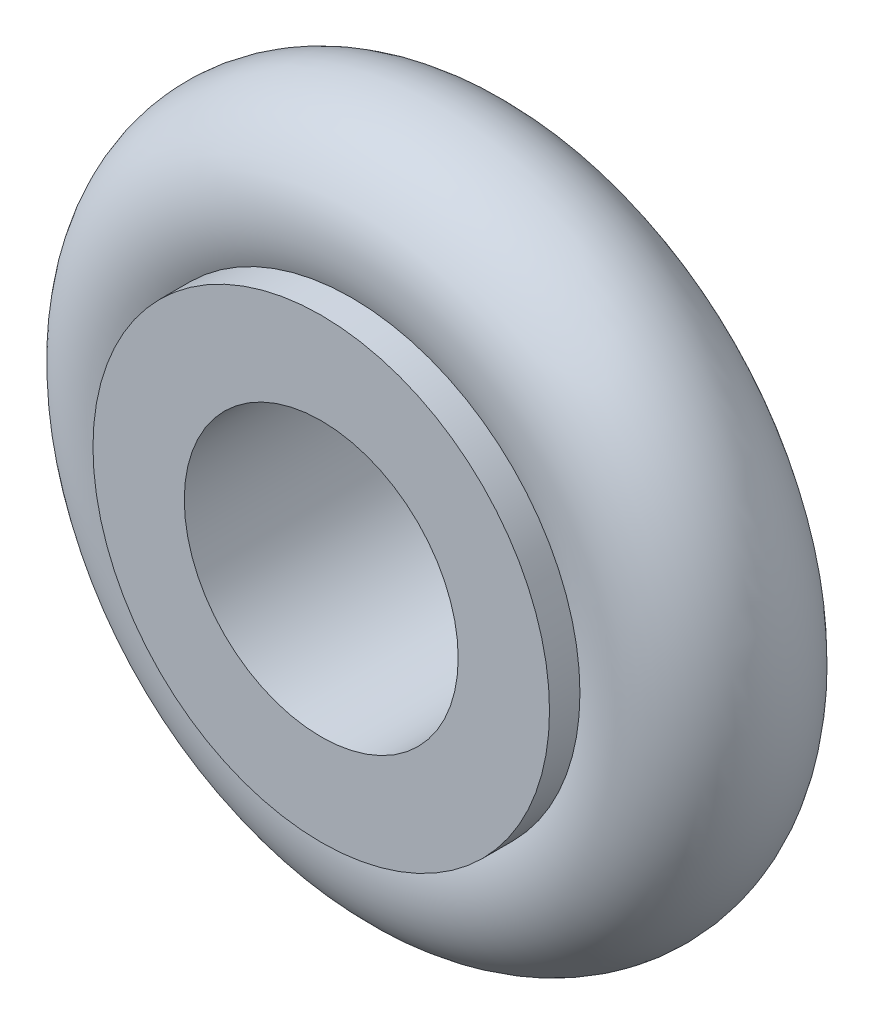
ISO-10303-21;
HEADER;
FILE_DESCRIPTION(('STEP AP214'),'2;1');
FILE_NAME('part.step','',(''),(''),'','','');
FILE_SCHEMA(('AUTOMOTIVE_DESIGN { 1 0 10303 214 1 1 1 1 }'));
ENDSEC;
DATA;
#1=APPLICATION_CONTEXT('core data for automotive mechanical design processes');
#2=APPLICATION_PROTOCOL_DEFINITION('international standard','automotive_design',2000,#1);
#3=PRODUCT_CONTEXT('',#1,'mechanical');
#4=PRODUCT('Part','Part','',(#3));
#5=PRODUCT_RELATED_PRODUCT_CATEGORY('part','',(#4));
#6=PRODUCT_DEFINITION_FORMATION('','',#4);
#7=PRODUCT_DEFINITION_CONTEXT('part definition',#1,'design');
#8=PRODUCT_DEFINITION('design','',#6,#7);
#9=PRODUCT_DEFINITION_SHAPE('','',#8);
#10=(LENGTH_UNIT() NAMED_UNIT(*) SI_UNIT(.MILLI.,.METRE.));
#11=(NAMED_UNIT(*) PLANE_ANGLE_UNIT() SI_UNIT($,.RADIAN.));
#12=(NAMED_UNIT(*) SI_UNIT($,.STERADIAN.) SOLID_ANGLE_UNIT());
#13=UNCERTAINTY_MEASURE_WITH_UNIT(LENGTH_MEASURE(1.E-05),#10,'distance_accuracy_value','');
#14=(GEOMETRIC_REPRESENTATION_CONTEXT(3) GLOBAL_UNCERTAINTY_ASSIGNED_CONTEXT((#13)) GLOBAL_UNIT_ASSIGNED_CONTEXT((#10,
#11,#12)) REPRESENTATION_CONTEXT('',''));
#15=CARTESIAN_POINT('',(0.,0.,0.));
#16=DIRECTION('',(0.,0.,1.));
#17=DIRECTION('',(1.,0.,0.));
#18=AXIS2_PLACEMENT_3D('',#15,#16,#17);
#19=CARTESIAN_POINT('',(0.,0.,0.));
#20=DIRECTION('',(0.,0.,1.));
#21=DIRECTION('',(1.,0.,0.));
#22=AXIS2_PLACEMENT_3D('',#19,#20,#21);
#23=TOROIDAL_SURFACE('',#22,4.28955259373304,1.5);
#24=CARTESIAN_POINT('',(5.78955259373304,0.,0.));
#25=VERTEX_POINT('',#24);
#26=VERTEX_LOOP('',#25);
#27=FACE_BOUND('',#26,.T.);
#28=ADVANCED_FACE('F42',(#27),#23,.T.);
#29=CLOSED_SHELL('',(#28));
#30=MANIFOLD_SOLID_BREP('B2',#29);
#31=CARTESIAN_POINT('',(0.,0.,-1.9));
#32=DIRECTION('',(0.,0.,-1.));
#33=DIRECTION('',(-1.,0.,0.));
#34=AXIS2_PLACEMENT_3D('',#31,#32,#33);
#35=PLANE('',#34);
#36=CARTESIAN_POINT('',(0.,0.,-1.9));
#37=DIRECTION('',(0.,0.,-1.));
#38=DIRECTION('',(-1.,0.,0.));
#39=AXIS2_PLACEMENT_3D('',#36,#37,#38);
#40=CIRCLE('',#39,2.25);
#41=CARTESIAN_POINT('',(-2.25,0.,-1.9));
#42=VERTEX_POINT('',#41);
#43=EDGE_CURVE('E80',#42,#42,#40,.F.);
#44=ORIENTED_EDGE('',*,*,#43,.T.);
#45=EDGE_LOOP('',(#44));
#46=FACE_BOUND('',#45,.T.);
#47=CARTESIAN_POINT('',(0.,0.,-1.9));
#48=DIRECTION('',(0.,0.,-1.));
#49=DIRECTION('',(-1.,0.,0.));
#50=AXIS2_PLACEMENT_3D('',#47,#48,#49);
#51=CIRCLE('',#50,3.75);
#52=CARTESIAN_POINT('',(-3.75,0.,-1.9));
#53=VERTEX_POINT('',#52);
#54=EDGE_CURVE('E41',#53,#53,#51,.T.);
#55=ORIENTED_EDGE('',*,*,#54,.T.);
#56=EDGE_LOOP('',(#55));
#57=FACE_BOUND('',#56,.T.);
#58=ADVANCED_FACE('F54',(#46,#57),#35,.T.);
#59=CARTESIAN_POINT('',(0.,0.,-6.22705657946134));
#60=DIRECTION('',(0.,0.,-1.));
#61=DIRECTION('',(-1.,0.,0.));
#62=AXIS2_PLACEMENT_3D('',#59,#60,#61);
#63=CYLINDRICAL_SURFACE('',#62,3.75);
#64=CARTESIAN_POINT('',(0.,0.,-1.4));
#65=DIRECTION('',(0.,0.,-1.));
#66=DIRECTION('',(-1.,0.,0.));
#67=AXIS2_PLACEMENT_3D('',#64,#65,#66);
#68=CIRCLE('',#67,3.75);
#69=CARTESIAN_POINT('',(-3.75,0.,-1.4));
#70=VERTEX_POINT('',#69);
#71=EDGE_CURVE('E60',#70,#70,#68,.T.);
#72=ORIENTED_EDGE('',*,*,#71,.T.);
#73=EDGE_LOOP('',(#72));
#74=FACE_BOUND('',#73,.T.);
#75=ORIENTED_EDGE('',*,*,#54,.F.);
#76=EDGE_LOOP('',(#75));
#77=FACE_BOUND('',#76,.T.);
#78=ADVANCED_FACE('F115',(#74,#77),#63,.T.);
#79=CARTESIAN_POINT('',(0.,0.,-1.4));
#80=DIRECTION('',(0.,0.,-1.));
#81=DIRECTION('',(-1.,0.,0.));
#82=AXIS2_PLACEMENT_3D('',#79,#80,#81);
#83=CONICAL_SURFACE('',#82,3.75,1.22522113490003);
#84=CARTESIAN_POINT('',(0.,0.,-1.05));
#85=DIRECTION('',(0.,0.,-1.));
#86=DIRECTION('',(-1.,0.,0.));
#87=AXIS2_PLACEMENT_3D('',#84,#85,#86);
#88=CIRCLE('',#87,2.77783760112974);
#89=CARTESIAN_POINT('',(-2.77783760112974,0.,-1.05));
#90=VERTEX_POINT('',#89);
#91=EDGE_CURVE('E64',#90,#90,#88,.T.);
#92=ORIENTED_EDGE('',*,*,#91,.T.);
#93=EDGE_LOOP('',(#92));
#94=FACE_BOUND('',#93,.T.);
#95=ORIENTED_EDGE('',*,*,#71,.F.);
#96=EDGE_LOOP('',(#95));
#97=FACE_BOUND('',#96,.T.);
#98=ADVANCED_FACE('F109',(#94,#97),#83,.T.);
#99=CARTESIAN_POINT('',(0.,0.,-6.22705657946134));
#100=DIRECTION('',(0.,0.,-1.));
#101=DIRECTION('',(-1.,0.,0.));
#102=AXIS2_PLACEMENT_3D('',#99,#100,#101);
#103=CYLINDRICAL_SURFACE('',#102,2.77783760112974);
#104=CARTESIAN_POINT('',(0.,0.,1.05));
#105=DIRECTION('',(0.,0.,-1.));
#106=DIRECTION('',(-1.,0.,0.));
#107=AXIS2_PLACEMENT_3D('',#104,#105,#106);
#108=CIRCLE('',#107,2.77783760112974);
#109=CARTESIAN_POINT('',(-2.77783760112974,0.,1.05));
#110=VERTEX_POINT('',#109);
#111=EDGE_CURVE('E68',#110,#110,#108,.T.);
#112=ORIENTED_EDGE('',*,*,#111,.T.);
#113=EDGE_LOOP('',(#112));
#114=FACE_BOUND('',#113,.T.);
#115=ORIENTED_EDGE('',*,*,#91,.F.);
#116=EDGE_LOOP('',(#115));
#117=FACE_BOUND('',#116,.T.);
#118=ADVANCED_FACE('F103',(#114,#117),#103,.T.);
#119=CARTESIAN_POINT('',(0.,0.,1.05));
#120=DIRECTION('',(0.,0.,1.));
#121=DIRECTION('',(1.,0.,0.));
#122=AXIS2_PLACEMENT_3D('',#119,#120,#121);
#123=CONICAL_SURFACE('',#122,2.77783760112974,1.22522113490003);
#124=CARTESIAN_POINT('',(0.,0.,1.4));
#125=DIRECTION('',(0.,0.,-1.));
#126=DIRECTION('',(-1.,0.,0.));
#127=AXIS2_PLACEMENT_3D('',#124,#125,#126);
#128=CIRCLE('',#127,3.75);
#129=CARTESIAN_POINT('',(-3.75,0.,1.4));
#130=VERTEX_POINT('',#129);
#131=EDGE_CURVE('E73',#130,#130,#128,.T.);
#132=ORIENTED_EDGE('',*,*,#131,.T.);
#133=EDGE_LOOP('',(#132));
#134=FACE_BOUND('',#133,.T.);
#135=ORIENTED_EDGE('',*,*,#111,.F.);
#136=EDGE_LOOP('',(#135));
#137=FACE_BOUND('',#136,.T.);
#138=ADVANCED_FACE('F97',(#134,#137),#123,.T.);
#139=CARTESIAN_POINT('',(0.,0.,-6.22705657946134));
#140=DIRECTION('',(0.,0.,-1.));
#141=DIRECTION('',(-1.,0.,0.));
#142=AXIS2_PLACEMENT_3D('',#139,#140,#141);
#143=CYLINDRICAL_SURFACE('',#142,3.75);
#144=CARTESIAN_POINT('',(0.,0.,1.9));
#145=DIRECTION('',(0.,0.,-1.));
#146=DIRECTION('',(-1.,0.,0.));
#147=AXIS2_PLACEMENT_3D('',#144,#145,#146);
#148=CIRCLE('',#147,3.75);
#149=CARTESIAN_POINT('',(-3.75,0.,1.9));
#150=VERTEX_POINT('',#149);
#151=EDGE_CURVE('E76',#150,#150,#148,.T.);
#152=ORIENTED_EDGE('',*,*,#151,.T.);
#153=EDGE_LOOP('',(#152));
#154=FACE_BOUND('',#153,.T.);
#155=ORIENTED_EDGE('',*,*,#131,.F.);
#156=EDGE_LOOP('',(#155));
#157=FACE_BOUND('',#156,.T.);
#158=ADVANCED_FACE('F91',(#154,#157),#143,.T.);
#159=CARTESIAN_POINT('',(0.,0.,1.9));
#160=DIRECTION('',(0.,0.,1.));
#161=DIRECTION('',(1.,0.,0.));
#162=AXIS2_PLACEMENT_3D('',#159,#160,#161);
#163=PLANE('',#162);
#164=CARTESIAN_POINT('',(0.,0.,1.9));
#165=DIRECTION('',(0.,0.,1.));
#166=DIRECTION('',(1.,0.,0.));
#167=AXIS2_PLACEMENT_3D('',#164,#165,#166);
#168=CIRCLE('',#167,2.25);
#169=CARTESIAN_POINT('',(2.25,0.,1.9));
#170=VERTEX_POINT('',#169);
#171=EDGE_CURVE('E79',#170,#170,#168,.T.);
#172=ORIENTED_EDGE('',*,*,#171,.F.);
#173=EDGE_LOOP('',(#172));
#174=FACE_BOUND('',#173,.T.);
#175=ORIENTED_EDGE('',*,*,#151,.F.);
#176=EDGE_LOOP('',(#175));
#177=FACE_BOUND('',#176,.T.);
#178=ADVANCED_FACE('F88',(#174,#177),#163,.T.);
#179=CARTESIAN_POINT('',(0.,0.,-1.901));
#180=DIRECTION('',(0.,0.,1.));
#181=DIRECTION('',(1.,0.,0.));
#182=AXIS2_PLACEMENT_3D('',#179,#180,#181);
#183=CYLINDRICAL_SURFACE('',#182,2.25);
#184=ORIENTED_EDGE('',*,*,#43,.F.);
#185=EDGE_LOOP('',(#184));
#186=FACE_BOUND('',#185,.T.);
#187=ORIENTED_EDGE('',*,*,#171,.T.);
#188=EDGE_LOOP('',(#187));
#189=FACE_BOUND('',#188,.T.);
#190=ADVANCED_FACE('F86',(#186,#189),#183,.F.);
#191=CLOSED_SHELL('',(#58,#78,#98,#118,#138,#158,#178,#190));
#192=MANIFOLD_SOLID_BREP('B6',#191);
#193=ADVANCED_BREP_SHAPE_REPRESENTATION('',(#18,#30,#192),#14);
#194=SHAPE_DEFINITION_REPRESENTATION(#9,#193);
ENDSEC;
END-ISO-10303-21;
